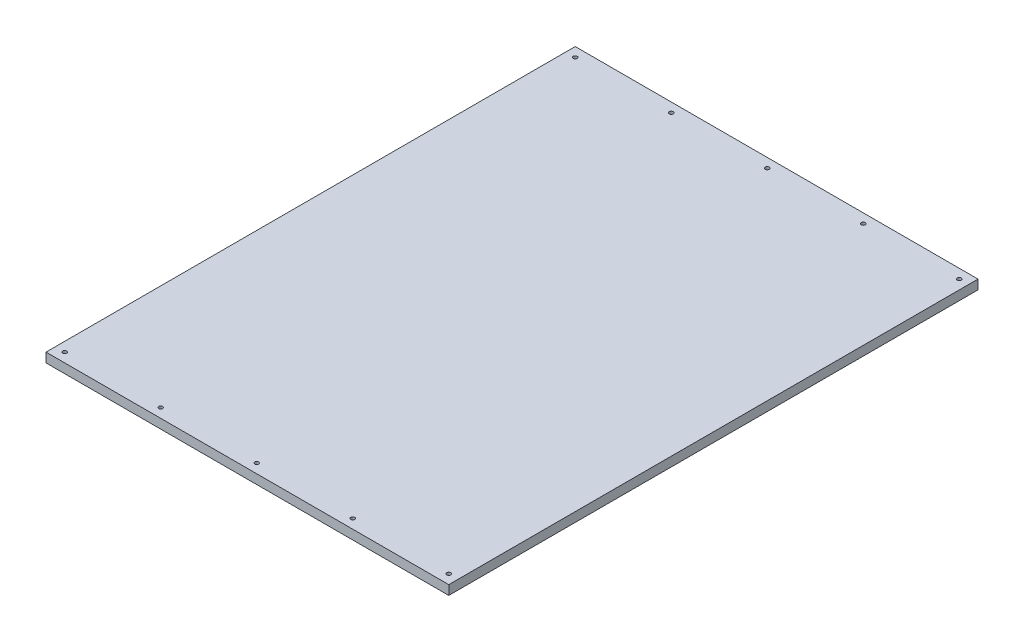
ISO-10303-21;
HEADER;
FILE_DESCRIPTION(('STEP AP214'),'2;1');
FILE_NAME('part.step','',(''),(''),'','','');
FILE_SCHEMA(('AUTOMOTIVE_DESIGN { 1 0 10303 214 1 1 1 1 }'));
ENDSEC;
DATA;
#1=APPLICATION_CONTEXT('core data for automotive mechanical design processes');
#2=APPLICATION_PROTOCOL_DEFINITION('international standard','automotive_design',2000,#1);
#3=PRODUCT_CONTEXT('',#1,'mechanical');
#4=PRODUCT('Part','Part','',(#3));
#5=PRODUCT_RELATED_PRODUCT_CATEGORY('part','',(#4));
#6=PRODUCT_DEFINITION_FORMATION('','',#4);
#7=PRODUCT_DEFINITION_CONTEXT('part definition',#1,'design');
#8=PRODUCT_DEFINITION('design','',#6,#7);
#9=PRODUCT_DEFINITION_SHAPE('','',#8);
#10=(LENGTH_UNIT() NAMED_UNIT(*) SI_UNIT(.MILLI.,.METRE.));
#11=(NAMED_UNIT(*) PLANE_ANGLE_UNIT() SI_UNIT($,.RADIAN.));
#12=(NAMED_UNIT(*) SI_UNIT($,.STERADIAN.) SOLID_ANGLE_UNIT());
#13=UNCERTAINTY_MEASURE_WITH_UNIT(LENGTH_MEASURE(1.E-05),#10,'distance_accuracy_value','');
#14=(GEOMETRIC_REPRESENTATION_CONTEXT(3) GLOBAL_UNCERTAINTY_ASSIGNED_CONTEXT((#13)) GLOBAL_UNIT_ASSIGNED_CONTEXT((#10,
#11,#12)) REPRESENTATION_CONTEXT('',''));
#15=CARTESIAN_POINT('',(0.,0.,0.));
#16=DIRECTION('',(0.,0.,1.));
#17=DIRECTION('',(1.,0.,0.));
#18=AXIS2_PLACEMENT_3D('',#15,#16,#17);
#19=CARTESIAN_POINT('',(215.,10.,-282.5));
#20=DIRECTION('',(-1.,0.,0.));
#21=DIRECTION('',(0.,0.,1.));
#22=AXIS2_PLACEMENT_3D('',#19,#20,#21);
#23=PLANE('',#22);
#24=DIRECTION('',(0.,0.,-1.));
#25=VECTOR('',#24,1.);
#26=CARTESIAN_POINT('',(215.,0.,-282.5));
#27=LINE('',#26,#25);
#28=CARTESIAN_POINT('',(215.,0.,282.5));
#29=VERTEX_POINT('',#28);
#30=CARTESIAN_POINT('',(215.,0.,-282.5));
#31=VERTEX_POINT('',#30);
#32=EDGE_CURVE('E111',#29,#31,#27,.T.);
#33=ORIENTED_EDGE('',*,*,#32,.T.);
#34=DIRECTION('',(0.,-1.,0.));
#35=VECTOR('',#34,1.);
#36=CARTESIAN_POINT('',(215.,10.,-282.5));
#37=LINE('',#36,#35);
#38=CARTESIAN_POINT('',(215.,10.,-282.5));
#39=VERTEX_POINT('',#38);
#40=EDGE_CURVE('E11',#39,#31,#37,.T.);
#41=ORIENTED_EDGE('',*,*,#40,.F.);
#42=DIRECTION('',(0.,0.,-1.));
#43=VECTOR('',#42,1.);
#44=CARTESIAN_POINT('',(215.,10.,-282.5));
#45=LINE('',#44,#43);
#46=CARTESIAN_POINT('',(215.,10.,282.5));
#47=VERTEX_POINT('',#46);
#48=EDGE_CURVE('E95',#47,#39,#45,.T.);
#49=ORIENTED_EDGE('',*,*,#48,.F.);
#50=DIRECTION('',(0.,-1.,0.));
#51=VECTOR('',#50,1.);
#52=CARTESIAN_POINT('',(215.,10.,282.5));
#53=LINE('',#52,#51);
#54=EDGE_CURVE('E107',#47,#29,#53,.T.);
#55=ORIENTED_EDGE('',*,*,#54,.T.);
#56=EDGE_LOOP('',(#33,#41,#49,#55));
#57=FACE_BOUND('',#56,.T.);
#58=ADVANCED_FACE('F43',(#57),#23,.F.);
#59=CARTESIAN_POINT('',(-215.,10.,-282.5));
#60=DIRECTION('',(0.,0.,1.));
#61=DIRECTION('',(1.,0.,0.));
#62=AXIS2_PLACEMENT_3D('',#59,#60,#61);
#63=PLANE('',#62);
#64=DIRECTION('',(-1.,0.,0.));
#65=VECTOR('',#64,1.);
#66=CARTESIAN_POINT('',(-215.,0.,-282.5));
#67=LINE('',#66,#65);
#68=CARTESIAN_POINT('',(-215.,0.,-282.5));
#69=VERTEX_POINT('',#68);
#70=EDGE_CURVE('E100',#31,#69,#67,.T.);
#71=ORIENTED_EDGE('',*,*,#70,.T.);
#72=DIRECTION('',(0.,-1.,0.));
#73=VECTOR('',#72,1.);
#74=CARTESIAN_POINT('',(-215.,10.,-282.5));
#75=LINE('',#74,#73);
#76=CARTESIAN_POINT('',(-215.,10.,-282.5));
#77=VERTEX_POINT('',#76);
#78=EDGE_CURVE('E52',#77,#69,#75,.T.);
#79=ORIENTED_EDGE('',*,*,#78,.F.);
#80=DIRECTION('',(-1.,0.,0.));
#81=VECTOR('',#80,1.);
#82=CARTESIAN_POINT('',(-215.,10.,-282.5));
#83=LINE('',#82,#81);
#84=EDGE_CURVE('E90',#39,#77,#83,.T.);
#85=ORIENTED_EDGE('',*,*,#84,.F.);
#86=ORIENTED_EDGE('',*,*,#40,.T.);
#87=EDGE_LOOP('',(#71,#79,#85,#86));
#88=FACE_BOUND('',#87,.T.);
#89=ADVANCED_FACE('F99',(#88),#63,.F.);
#90=CARTESIAN_POINT('',(-215.,10.,-282.5));
#91=DIRECTION('',(1.,0.,0.));
#92=DIRECTION('',(0.,0.,-1.));
#93=AXIS2_PLACEMENT_3D('',#90,#91,#92);
#94=PLANE('',#93);
#95=DIRECTION('',(0.,0.,1.));
#96=VECTOR('',#95,1.);
#97=CARTESIAN_POINT('',(-215.,0.,-282.5));
#98=LINE('',#97,#96);
#99=CARTESIAN_POINT('',(-215.,0.,282.5));
#100=VERTEX_POINT('',#99);
#101=EDGE_CURVE('E77',#69,#100,#98,.T.);
#102=ORIENTED_EDGE('',*,*,#101,.T.);
#103=DIRECTION('',(0.,-1.,0.));
#104=VECTOR('',#103,1.);
#105=CARTESIAN_POINT('',(-215.,10.,282.5));
#106=LINE('',#105,#104);
#107=CARTESIAN_POINT('',(-215.,10.,282.5));
#108=VERTEX_POINT('',#107);
#109=EDGE_CURVE('E102',#108,#100,#106,.T.);
#110=ORIENTED_EDGE('',*,*,#109,.F.);
#111=DIRECTION('',(0.,0.,1.));
#112=VECTOR('',#111,1.);
#113=CARTESIAN_POINT('',(-215.,10.,-282.5));
#114=LINE('',#113,#112);
#115=EDGE_CURVE('E93',#77,#108,#114,.T.);
#116=ORIENTED_EDGE('',*,*,#115,.F.);
#117=ORIENTED_EDGE('',*,*,#78,.T.);
#118=EDGE_LOOP('',(#102,#110,#116,#117));
#119=FACE_BOUND('',#118,.T.);
#120=ADVANCED_FACE('F103',(#119),#94,.F.);
#121=CARTESIAN_POINT('',(-215.,10.,282.5));
#122=DIRECTION('',(0.,0.,-1.));
#123=DIRECTION('',(-1.,0.,0.));
#124=AXIS2_PLACEMENT_3D('',#121,#122,#123);
#125=PLANE('',#124);
#126=DIRECTION('',(1.,0.,0.));
#127=VECTOR('',#126,1.);
#128=CARTESIAN_POINT('',(-215.,0.,282.5));
#129=LINE('',#128,#127);
#130=EDGE_CURVE('E83',#100,#29,#129,.T.);
#131=ORIENTED_EDGE('',*,*,#130,.T.);
#132=ORIENTED_EDGE('',*,*,#54,.F.);
#133=DIRECTION('',(1.,0.,0.));
#134=VECTOR('',#133,1.);
#135=CARTESIAN_POINT('',(-215.,10.,282.5));
#136=LINE('',#135,#134);
#137=EDGE_CURVE('E60',#108,#47,#136,.T.);
#138=ORIENTED_EDGE('',*,*,#137,.F.);
#139=ORIENTED_EDGE('',*,*,#109,.T.);
#140=EDGE_LOOP('',(#131,#132,#138,#139));
#141=FACE_BOUND('',#140,.T.);
#142=ADVANCED_FACE('F125',(#141),#125,.F.);
#143=CARTESIAN_POINT('',(0.,10.,0.));
#144=DIRECTION('',(0.,1.,0.));
#145=DIRECTION('',(0.,0.,1.));
#146=AXIS2_PLACEMENT_3D('',#143,#144,#145);
#147=PLANE('',#146);
#148=CARTESIAN_POINT('',(102.500000000002,10.,-272.5));
#149=DIRECTION('',(0.,1.,0.));
#150=DIRECTION('',(0.,0.,1.));
#151=AXIS2_PLACEMENT_3D('',#148,#149,#150);
#152=CIRCLE('',#151,2.10000000000001);
#153=CARTESIAN_POINT('',(102.500000000002,10.,-270.4));
#154=VERTEX_POINT('',#153);
#155=EDGE_CURVE('E136',#154,#154,#152,.T.);
#156=ORIENTED_EDGE('',*,*,#155,.F.);
#157=EDGE_LOOP('',(#156));
#158=FACE_BOUND('',#157,.T.);
#159=CARTESIAN_POINT('',(205.000000000003,10.,-272.5));
#160=DIRECTION('',(0.,1.,0.));
#161=DIRECTION('',(0.,0.,1.));
#162=AXIS2_PLACEMENT_3D('',#159,#160,#161);
#163=CIRCLE('',#162,2.10000000000001);
#164=CARTESIAN_POINT('',(205.000000000003,10.,-270.4));
#165=VERTEX_POINT('',#164);
#166=EDGE_CURVE('E193',#165,#165,#163,.T.);
#167=ORIENTED_EDGE('',*,*,#166,.F.);
#168=EDGE_LOOP('',(#167));
#169=FACE_BOUND('',#168,.T.);
#170=CARTESIAN_POINT('',(-102.499999999998,10.,-272.5));
#171=DIRECTION('',(0.,1.,0.));
#172=DIRECTION('',(0.,0.,1.));
#173=AXIS2_PLACEMENT_3D('',#170,#171,#172);
#174=CIRCLE('',#173,2.1);
#175=CARTESIAN_POINT('',(-102.499999999998,10.,-270.4));
#176=VERTEX_POINT('',#175);
#177=EDGE_CURVE('E185',#176,#176,#174,.T.);
#178=ORIENTED_EDGE('',*,*,#177,.F.);
#179=EDGE_LOOP('',(#178));
#180=FACE_BOUND('',#179,.T.);
#181=CARTESIAN_POINT('',(-205.,10.,-272.5));
#182=DIRECTION('',(0.,1.,0.));
#183=DIRECTION('',(0.,0.,1.));
#184=AXIS2_PLACEMENT_3D('',#181,#182,#183);
#185=CIRCLE('',#184,2.09999999999999);
#186=CARTESIAN_POINT('',(-205.,10.,-270.4));
#187=VERTEX_POINT('',#186);
#188=EDGE_CURVE('E177',#187,#187,#185,.T.);
#189=ORIENTED_EDGE('',*,*,#188,.F.);
#190=EDGE_LOOP('',(#189));
#191=FACE_BOUND('',#190,.T.);
#192=CARTESIAN_POINT('',(205.000000000003,10.,272.5));
#193=DIRECTION('',(0.,1.,0.));
#194=DIRECTION('',(0.,0.,-1.));
#195=AXIS2_PLACEMENT_3D('',#192,#193,#194);
#196=CIRCLE('',#195,2.10000000000001);
#197=CARTESIAN_POINT('',(205.000000000003,10.,270.4));
#198=VERTEX_POINT('',#197);
#199=EDGE_CURVE('E169',#198,#198,#196,.T.);
#200=ORIENTED_EDGE('',*,*,#199,.F.);
#201=EDGE_LOOP('',(#200));
#202=FACE_BOUND('',#201,.T.);
#203=CARTESIAN_POINT('',(102.500000000002,10.,272.5));
#204=DIRECTION('',(0.,1.,0.));
#205=DIRECTION('',(0.,0.,-1.));
#206=AXIS2_PLACEMENT_3D('',#203,#204,#205);
#207=CIRCLE('',#206,2.10000000000001);
#208=CARTESIAN_POINT('',(102.500000000002,10.,270.4));
#209=VERTEX_POINT('',#208);
#210=EDGE_CURVE('E161',#209,#209,#207,.T.);
#211=ORIENTED_EDGE('',*,*,#210,.F.);
#212=EDGE_LOOP('',(#211));
#213=FACE_BOUND('',#212,.T.);
#214=CARTESIAN_POINT('',(1.58206781009085E-12,10.,272.5));
#215=DIRECTION('',(0.,1.,0.));
#216=DIRECTION('',(0.,0.,-1.));
#217=AXIS2_PLACEMENT_3D('',#214,#215,#216);
#218=CIRCLE('',#217,2.1);
#219=CARTESIAN_POINT('',(1.58206781009085E-12,10.,270.4));
#220=VERTEX_POINT('',#219);
#221=EDGE_CURVE('E153',#220,#220,#218,.T.);
#222=ORIENTED_EDGE('',*,*,#221,.F.);
#223=EDGE_LOOP('',(#222));
#224=FACE_BOUND('',#223,.T.);
#225=CARTESIAN_POINT('',(-102.499999999998,10.,272.5));
#226=DIRECTION('',(0.,1.,0.));
#227=DIRECTION('',(0.,0.,-1.));
#228=AXIS2_PLACEMENT_3D('',#225,#226,#227);
#229=CIRCLE('',#228,2.1);
#230=CARTESIAN_POINT('',(-102.499999999998,10.,270.4));
#231=VERTEX_POINT('',#230);
#232=EDGE_CURVE('E144',#231,#231,#229,.T.);
#233=ORIENTED_EDGE('',*,*,#232,.F.);
#234=EDGE_LOOP('',(#233));
#235=FACE_BOUND('',#234,.T.);
#236=CARTESIAN_POINT('',(-205.,10.,272.5));
#237=DIRECTION('',(0.,1.,0.));
#238=DIRECTION('',(0.,0.,-1.));
#239=AXIS2_PLACEMENT_3D('',#236,#237,#238);
#240=CIRCLE('',#239,2.09999999999999);
#241=CARTESIAN_POINT('',(-205.,10.,270.4));
#242=VERTEX_POINT('',#241);
#243=EDGE_CURVE('E145',#242,#242,#240,.T.);
#244=ORIENTED_EDGE('',*,*,#243,.F.);
#245=EDGE_LOOP('',(#244));
#246=FACE_BOUND('',#245,.T.);
#247=CARTESIAN_POINT('',(1.58206781009085E-12,10.,-272.5));
#248=DIRECTION('',(0.,1.,0.));
#249=DIRECTION('',(0.,0.,1.));
#250=AXIS2_PLACEMENT_3D('',#247,#248,#249);
#251=CIRCLE('',#250,2.1);
#252=CARTESIAN_POINT('',(1.58206781009085E-12,10.,-270.4));
#253=VERTEX_POINT('',#252);
#254=EDGE_CURVE('E132',#253,#253,#251,.T.);
#255=ORIENTED_EDGE('',*,*,#254,.F.);
#256=EDGE_LOOP('',(#255));
#257=FACE_BOUND('',#256,.T.);
#258=ORIENTED_EDGE('',*,*,#48,.T.);
#259=ORIENTED_EDGE('',*,*,#84,.T.);
#260=ORIENTED_EDGE('',*,*,#115,.T.);
#261=ORIENTED_EDGE('',*,*,#137,.T.);
#262=EDGE_LOOP('',(#258,#259,#260,#261));
#263=FACE_BOUND('',#262,.T.);
#264=ADVANCED_FACE('F91',(#158,#169,#180,#191,#202,#213,#224,#235,#246,#257,#263),#147,.T.);
#265=CARTESIAN_POINT('',(0.,0.,0.));
#266=DIRECTION('',(0.,1.,0.));
#267=DIRECTION('',(0.,0.,1.));
#268=AXIS2_PLACEMENT_3D('',#265,#266,#267);
#269=PLANE('',#268);
#270=CARTESIAN_POINT('',(102.500000000002,0.,-272.5));
#271=DIRECTION('',(0.,1.,0.));
#272=DIRECTION('',(0.,0.,1.));
#273=AXIS2_PLACEMENT_3D('',#270,#271,#272);
#274=CIRCLE('',#273,2.10000000000001);
#275=CARTESIAN_POINT('',(102.500000000002,0.,-270.4));
#276=VERTEX_POINT('',#275);
#277=EDGE_CURVE('E197',#276,#276,#274,.T.);
#278=ORIENTED_EDGE('',*,*,#277,.T.);
#279=EDGE_LOOP('',(#278));
#280=FACE_BOUND('',#279,.T.);
#281=CARTESIAN_POINT('',(205.000000000003,0.,-272.5));
#282=DIRECTION('',(0.,1.,0.));
#283=DIRECTION('',(0.,0.,1.));
#284=AXIS2_PLACEMENT_3D('',#281,#282,#283);
#285=CIRCLE('',#284,2.10000000000001);
#286=CARTESIAN_POINT('',(205.000000000003,0.,-270.4));
#287=VERTEX_POINT('',#286);
#288=EDGE_CURVE('E189',#287,#287,#285,.T.);
#289=ORIENTED_EDGE('',*,*,#288,.T.);
#290=EDGE_LOOP('',(#289));
#291=FACE_BOUND('',#290,.T.);
#292=CARTESIAN_POINT('',(-102.499999999998,0.,-272.5));
#293=DIRECTION('',(0.,1.,0.));
#294=DIRECTION('',(0.,0.,1.));
#295=AXIS2_PLACEMENT_3D('',#292,#293,#294);
#296=CIRCLE('',#295,2.1);
#297=CARTESIAN_POINT('',(-102.499999999998,0.,-270.4));
#298=VERTEX_POINT('',#297);
#299=EDGE_CURVE('E181',#298,#298,#296,.T.);
#300=ORIENTED_EDGE('',*,*,#299,.T.);
#301=EDGE_LOOP('',(#300));
#302=FACE_BOUND('',#301,.T.);
#303=CARTESIAN_POINT('',(-205.,0.,-272.5));
#304=DIRECTION('',(0.,1.,0.));
#305=DIRECTION('',(0.,0.,1.));
#306=AXIS2_PLACEMENT_3D('',#303,#304,#305);
#307=CIRCLE('',#306,2.09999999999999);
#308=CARTESIAN_POINT('',(-205.,0.,-270.4));
#309=VERTEX_POINT('',#308);
#310=EDGE_CURVE('E173',#309,#309,#307,.T.);
#311=ORIENTED_EDGE('',*,*,#310,.T.);
#312=EDGE_LOOP('',(#311));
#313=FACE_BOUND('',#312,.T.);
#314=CARTESIAN_POINT('',(205.000000000003,0.,272.5));
#315=DIRECTION('',(0.,1.,0.));
#316=DIRECTION('',(0.,0.,-1.));
#317=AXIS2_PLACEMENT_3D('',#314,#315,#316);
#318=CIRCLE('',#317,2.10000000000001);
#319=CARTESIAN_POINT('',(205.000000000003,0.,270.4));
#320=VERTEX_POINT('',#319);
#321=EDGE_CURVE('E165',#320,#320,#318,.T.);
#322=ORIENTED_EDGE('',*,*,#321,.T.);
#323=EDGE_LOOP('',(#322));
#324=FACE_BOUND('',#323,.T.);
#325=CARTESIAN_POINT('',(102.500000000002,0.,272.5));
#326=DIRECTION('',(0.,1.,0.));
#327=DIRECTION('',(0.,0.,-1.));
#328=AXIS2_PLACEMENT_3D('',#325,#326,#327);
#329=CIRCLE('',#328,2.10000000000001);
#330=CARTESIAN_POINT('',(102.500000000002,0.,270.4));
#331=VERTEX_POINT('',#330);
#332=EDGE_CURVE('E157',#331,#331,#329,.T.);
#333=ORIENTED_EDGE('',*,*,#332,.T.);
#334=EDGE_LOOP('',(#333));
#335=FACE_BOUND('',#334,.T.);
#336=CARTESIAN_POINT('',(1.58206781009085E-12,0.,272.5));
#337=DIRECTION('',(0.,1.,0.));
#338=DIRECTION('',(0.,0.,-1.));
#339=AXIS2_PLACEMENT_3D('',#336,#337,#338);
#340=CIRCLE('',#339,2.1);
#341=CARTESIAN_POINT('',(1.58206781009085E-12,0.,270.4));
#342=VERTEX_POINT('',#341);
#343=EDGE_CURVE('E149',#342,#342,#340,.T.);
#344=ORIENTED_EDGE('',*,*,#343,.T.);
#345=EDGE_LOOP('',(#344));
#346=FACE_BOUND('',#345,.T.);
#347=CARTESIAN_POINT('',(-102.499999999998,0.,272.5));
#348=DIRECTION('',(0.,1.,0.));
#349=DIRECTION('',(0.,0.,-1.));
#350=AXIS2_PLACEMENT_3D('',#347,#348,#349);
#351=CIRCLE('',#350,2.1);
#352=CARTESIAN_POINT('',(-102.499999999998,0.,270.4));
#353=VERTEX_POINT('',#352);
#354=EDGE_CURVE('E140',#353,#353,#351,.T.);
#355=ORIENTED_EDGE('',*,*,#354,.T.);
#356=EDGE_LOOP('',(#355));
#357=FACE_BOUND('',#356,.T.);
#358=CARTESIAN_POINT('',(-205.,0.,272.5));
#359=DIRECTION('',(0.,1.,0.));
#360=DIRECTION('',(0.,0.,-1.));
#361=AXIS2_PLACEMENT_3D('',#358,#359,#360);
#362=CIRCLE('',#361,2.09999999999999);
#363=CARTESIAN_POINT('',(-205.,0.,270.4));
#364=VERTEX_POINT('',#363);
#365=EDGE_CURVE('E204',#364,#364,#362,.T.);
#366=ORIENTED_EDGE('',*,*,#365,.T.);
#367=EDGE_LOOP('',(#366));
#368=FACE_BOUND('',#367,.T.);
#369=CARTESIAN_POINT('',(1.58206781009085E-12,0.,-272.5));
#370=DIRECTION('',(0.,1.,0.));
#371=DIRECTION('',(0.,0.,1.));
#372=AXIS2_PLACEMENT_3D('',#369,#370,#371);
#373=CIRCLE('',#372,2.1);
#374=CARTESIAN_POINT('',(1.58206781009085E-12,0.,-270.4));
#375=VERTEX_POINT('',#374);
#376=EDGE_CURVE('E115',#375,#375,#373,.T.);
#377=ORIENTED_EDGE('',*,*,#376,.T.);
#378=EDGE_LOOP('',(#377));
#379=FACE_BOUND('',#378,.T.);
#380=ORIENTED_EDGE('',*,*,#32,.F.);
#381=ORIENTED_EDGE('',*,*,#130,.F.);
#382=ORIENTED_EDGE('',*,*,#101,.F.);
#383=ORIENTED_EDGE('',*,*,#70,.F.);
#384=EDGE_LOOP('',(#380,#381,#382,#383));
#385=FACE_BOUND('',#384,.T.);
#386=ADVANCED_FACE('F128',(#280,#291,#302,#313,#324,#335,#346,#357,#368,#379,#385),#269,.F.);
#387=CARTESIAN_POINT('',(1.58206781009085E-12,0.,-272.5));
#388=DIRECTION('',(0.,1.,0.));
#389=DIRECTION('',(0.,0.,1.));
#390=AXIS2_PLACEMENT_3D('',#387,#388,#389);
#391=CYLINDRICAL_SURFACE('',#390,2.1);
#392=ORIENTED_EDGE('',*,*,#376,.F.);
#393=EDGE_LOOP('',(#392));
#394=FACE_BOUND('',#393,.T.);
#395=ORIENTED_EDGE('',*,*,#254,.T.);
#396=EDGE_LOOP('',(#395));
#397=FACE_BOUND('',#396,.T.);
#398=ADVANCED_FACE('F220',(#394,#397),#391,.F.);
#399=CARTESIAN_POINT('',(-205.,0.,272.5));
#400=DIRECTION('',(0.,1.,0.));
#401=DIRECTION('',(0.,0.,1.));
#402=AXIS2_PLACEMENT_3D('',#399,#400,#401);
#403=CYLINDRICAL_SURFACE('',#402,2.09999999999999);
#404=ORIENTED_EDGE('',*,*,#365,.F.);
#405=EDGE_LOOP('',(#404));
#406=FACE_BOUND('',#405,.T.);
#407=ORIENTED_EDGE('',*,*,#243,.T.);
#408=EDGE_LOOP('',(#407));
#409=FACE_BOUND('',#408,.T.);
#410=ADVANCED_FACE('F212',(#406,#409),#403,.F.);
#411=CARTESIAN_POINT('',(-102.499999999998,0.,272.5));
#412=DIRECTION('',(0.,1.,0.));
#413=DIRECTION('',(0.,0.,1.));
#414=AXIS2_PLACEMENT_3D('',#411,#412,#413);
#415=CYLINDRICAL_SURFACE('',#414,2.1);
#416=ORIENTED_EDGE('',*,*,#354,.F.);
#417=EDGE_LOOP('',(#416));
#418=FACE_BOUND('',#417,.T.);
#419=ORIENTED_EDGE('',*,*,#232,.T.);
#420=EDGE_LOOP('',(#419));
#421=FACE_BOUND('',#420,.T.);
#422=ADVANCED_FACE('F228',(#418,#421),#415,.F.);
#423=CARTESIAN_POINT('',(1.58206781009085E-12,0.,272.5));
#424=DIRECTION('',(0.,1.,0.));
#425=DIRECTION('',(0.,0.,1.));
#426=AXIS2_PLACEMENT_3D('',#423,#424,#425);
#427=CYLINDRICAL_SURFACE('',#426,2.1);
#428=ORIENTED_EDGE('',*,*,#343,.F.);
#429=EDGE_LOOP('',(#428));
#430=FACE_BOUND('',#429,.T.);
#431=ORIENTED_EDGE('',*,*,#221,.T.);
#432=EDGE_LOOP('',(#431));
#433=FACE_BOUND('',#432,.T.);
#434=ADVANCED_FACE('F279',(#430,#433),#427,.F.);
#435=CARTESIAN_POINT('',(102.500000000002,0.,272.5));
#436=DIRECTION('',(0.,1.,0.));
#437=DIRECTION('',(0.,0.,1.));
#438=AXIS2_PLACEMENT_3D('',#435,#436,#437);
#439=CYLINDRICAL_SURFACE('',#438,2.10000000000001);
#440=ORIENTED_EDGE('',*,*,#332,.F.);
#441=EDGE_LOOP('',(#440));
#442=FACE_BOUND('',#441,.T.);
#443=ORIENTED_EDGE('',*,*,#210,.T.);
#444=EDGE_LOOP('',(#443));
#445=FACE_BOUND('',#444,.T.);
#446=ADVANCED_FACE('F289',(#442,#445),#439,.F.);
#447=CARTESIAN_POINT('',(205.000000000003,0.,272.5));
#448=DIRECTION('',(0.,1.,0.));
#449=DIRECTION('',(0.,0.,1.));
#450=AXIS2_PLACEMENT_3D('',#447,#448,#449);
#451=CYLINDRICAL_SURFACE('',#450,2.10000000000001);
#452=ORIENTED_EDGE('',*,*,#321,.F.);
#453=EDGE_LOOP('',(#452));
#454=FACE_BOUND('',#453,.T.);
#455=ORIENTED_EDGE('',*,*,#199,.T.);
#456=EDGE_LOOP('',(#455));
#457=FACE_BOUND('',#456,.T.);
#458=ADVANCED_FACE('F300',(#454,#457),#451,.F.);
#459=CARTESIAN_POINT('',(-205.,0.,-272.5));
#460=DIRECTION('',(0.,1.,0.));
#461=DIRECTION('',(0.,0.,1.));
#462=AXIS2_PLACEMENT_3D('',#459,#460,#461);
#463=CYLINDRICAL_SURFACE('',#462,2.09999999999999);
#464=ORIENTED_EDGE('',*,*,#310,.F.);
#465=EDGE_LOOP('',(#464));
#466=FACE_BOUND('',#465,.T.);
#467=ORIENTED_EDGE('',*,*,#188,.T.);
#468=EDGE_LOOP('',(#467));
#469=FACE_BOUND('',#468,.T.);
#470=ADVANCED_FACE('F311',(#466,#469),#463,.F.);
#471=CARTESIAN_POINT('',(-102.499999999998,0.,-272.5));
#472=DIRECTION('',(0.,1.,0.));
#473=DIRECTION('',(0.,0.,1.));
#474=AXIS2_PLACEMENT_3D('',#471,#472,#473);
#475=CYLINDRICAL_SURFACE('',#474,2.1);
#476=ORIENTED_EDGE('',*,*,#299,.F.);
#477=EDGE_LOOP('',(#476));
#478=FACE_BOUND('',#477,.T.);
#479=ORIENTED_EDGE('',*,*,#177,.T.);
#480=EDGE_LOOP('',(#479));
#481=FACE_BOUND('',#480,.T.);
#482=ADVANCED_FACE('F322',(#478,#481),#475,.F.);
#483=CARTESIAN_POINT('',(205.000000000003,0.,-272.5));
#484=DIRECTION('',(0.,1.,0.));
#485=DIRECTION('',(0.,0.,1.));
#486=AXIS2_PLACEMENT_3D('',#483,#484,#485);
#487=CYLINDRICAL_SURFACE('',#486,2.10000000000001);
#488=ORIENTED_EDGE('',*,*,#288,.F.);
#489=EDGE_LOOP('',(#488));
#490=FACE_BOUND('',#489,.T.);
#491=ORIENTED_EDGE('',*,*,#166,.T.);
#492=EDGE_LOOP('',(#491));
#493=FACE_BOUND('',#492,.T.);
#494=ADVANCED_FACE('F333',(#490,#493),#487,.F.);
#495=CARTESIAN_POINT('',(102.500000000002,0.,-272.5));
#496=DIRECTION('',(0.,1.,0.));
#497=DIRECTION('',(0.,0.,1.));
#498=AXIS2_PLACEMENT_3D('',#495,#496,#497);
#499=CYLINDRICAL_SURFACE('',#498,2.10000000000001);
#500=ORIENTED_EDGE('',*,*,#277,.F.);
#501=EDGE_LOOP('',(#500));
#502=FACE_BOUND('',#501,.T.);
#503=ORIENTED_EDGE('',*,*,#155,.T.);
#504=EDGE_LOOP('',(#503));
#505=FACE_BOUND('',#504,.T.);
#506=ADVANCED_FACE('F344',(#502,#505),#499,.F.);
#507=CLOSED_SHELL('',(#58,#89,#120,#142,#264,#386,#398,#410,#422,#434,#446,#458,#470,#482,#494,#506));
#508=MANIFOLD_SOLID_BREP('B2',#507);
#509=ADVANCED_BREP_SHAPE_REPRESENTATION('',(#18,#508),#14);
#510=SHAPE_DEFINITION_REPRESENTATION(#9,#509);
ENDSEC;
END-ISO-10303-21;
